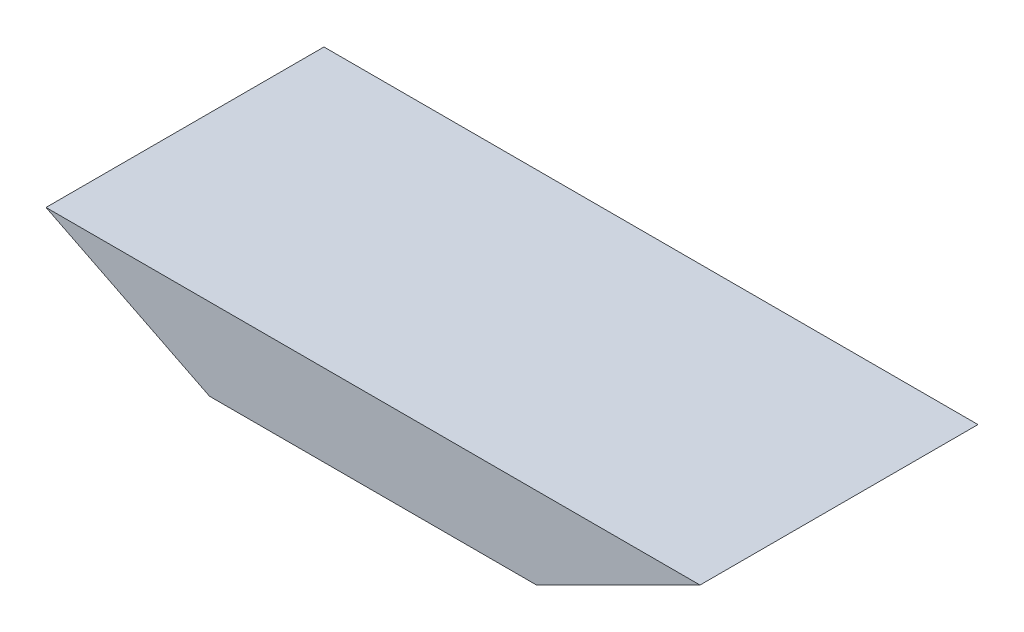
ISO-10303-21;
HEADER;
FILE_DESCRIPTION(('STEP AP214'),'2;1');
FILE_NAME('part.step','',(''),(''),'','','');
FILE_SCHEMA(('AUTOMOTIVE_DESIGN { 1 0 10303 214 1 1 1 1 }'));
ENDSEC;
DATA;
#1=APPLICATION_CONTEXT('core data for automotive mechanical design processes');
#2=APPLICATION_PROTOCOL_DEFINITION('international standard','automotive_design',2000,#1);
#3=PRODUCT_CONTEXT('',#1,'mechanical');
#4=PRODUCT('Part','Part','',(#3));
#5=PRODUCT_RELATED_PRODUCT_CATEGORY('part','',(#4));
#6=PRODUCT_DEFINITION_FORMATION('','',#4);
#7=PRODUCT_DEFINITION_CONTEXT('part definition',#1,'design');
#8=PRODUCT_DEFINITION('design','',#6,#7);
#9=PRODUCT_DEFINITION_SHAPE('','',#8);
#10=(LENGTH_UNIT() NAMED_UNIT(*) SI_UNIT(.MILLI.,.METRE.));
#11=(NAMED_UNIT(*) PLANE_ANGLE_UNIT() SI_UNIT($,.RADIAN.));
#12=(NAMED_UNIT(*) SI_UNIT($,.STERADIAN.) SOLID_ANGLE_UNIT());
#13=UNCERTAINTY_MEASURE_WITH_UNIT(LENGTH_MEASURE(1.E-05),#10,'distance_accuracy_value','');
#14=(GEOMETRIC_REPRESENTATION_CONTEXT(3) GLOBAL_UNCERTAINTY_ASSIGNED_CONTEXT((#13)) GLOBAL_UNIT_ASSIGNED_CONTEXT((#10,
#11,#12)) REPRESENTATION_CONTEXT('',''));
#15=CARTESIAN_POINT('',(0.,0.,0.));
#16=DIRECTION('',(0.,0.,1.));
#17=DIRECTION('',(1.,0.,0.));
#18=AXIS2_PLACEMENT_3D('',#15,#16,#17);
#19=CARTESIAN_POINT('',(-20.,5.,-8.5));
#20=DIRECTION('',(0.,0.,-1.));
#21=DIRECTION('',(-1.,0.,0.));
#22=AXIS2_PLACEMENT_3D('',#19,#20,#21);
#23=PLANE('',#22);
#24=DIRECTION('',(0.894427190999916,-0.447213595499958,0.));
#25=VECTOR('',#24,1.);
#26=CARTESIAN_POINT('',(-9.99999999999999,5.,-8.5));
#27=LINE('',#26,#25);
#28=CARTESIAN_POINT('',(-9.99999999999999,5.,-8.5));
#29=VERTEX_POINT('',#28);
#30=CARTESIAN_POINT('',(0.,0.,-8.5));
#31=VERTEX_POINT('',#30);
#32=EDGE_CURVE('E91',#29,#31,#27,.T.);
#33=ORIENTED_EDGE('',*,*,#32,.F.);
#34=DIRECTION('',(1.,0.,0.));
#35=VECTOR('',#34,1.);
#36=CARTESIAN_POINT('',(-20.,5.,-8.5));
#37=LINE('',#36,#35);
#38=CARTESIAN_POINT('',(30.,5.,-8.5));
#39=VERTEX_POINT('',#38);
#40=EDGE_CURVE('E43',#29,#39,#37,.T.);
#41=ORIENTED_EDGE('',*,*,#40,.T.);
#42=DIRECTION('',(-0.894427190999916,-0.447213595499958,0.));
#43=VECTOR('',#42,1.);
#44=CARTESIAN_POINT('',(30.,5.,-8.5));
#45=LINE('',#44,#43);
#46=CARTESIAN_POINT('',(20.,0.,-8.5));
#47=VERTEX_POINT('',#46);
#48=EDGE_CURVE('E90',#39,#47,#45,.T.);
#49=ORIENTED_EDGE('',*,*,#48,.T.);
#50=DIRECTION('',(1.,0.,0.));
#51=VECTOR('',#50,1.);
#52=CARTESIAN_POINT('',(-20.,0.,-8.5));
#53=LINE('',#52,#51);
#54=EDGE_CURVE('E51',#31,#47,#53,.T.);
#55=ORIENTED_EDGE('',*,*,#54,.F.);
#56=EDGE_LOOP('',(#33,#41,#49,#55));
#57=FACE_BOUND('',#56,.T.);
#58=ADVANCED_FACE('F35',(#57),#23,.T.);
#59=CARTESIAN_POINT('',(-20.,5.,8.5));
#60=DIRECTION('',(0.,0.,-1.));
#61=DIRECTION('',(-1.,0.,0.));
#62=AXIS2_PLACEMENT_3D('',#59,#60,#61);
#63=PLANE('',#62);
#64=DIRECTION('',(1.,0.,0.));
#65=VECTOR('',#64,1.);
#66=CARTESIAN_POINT('',(-20.,5.,8.5));
#67=LINE('',#66,#65);
#68=CARTESIAN_POINT('',(-9.99999999999999,5.,8.5));
#69=VERTEX_POINT('',#68);
#70=CARTESIAN_POINT('',(30.,5.,8.5));
#71=VERTEX_POINT('',#70);
#72=EDGE_CURVE('E11',#69,#71,#67,.T.);
#73=ORIENTED_EDGE('',*,*,#72,.F.);
#74=DIRECTION('',(0.894427190999916,-0.447213595499958,0.));
#75=VECTOR('',#74,1.);
#76=CARTESIAN_POINT('',(-9.99999999999999,5.,8.5));
#77=LINE('',#76,#75);
#78=CARTESIAN_POINT('',(0.,0.,8.5));
#79=VERTEX_POINT('',#78);
#80=EDGE_CURVE('E59',#69,#79,#77,.T.);
#81=ORIENTED_EDGE('',*,*,#80,.T.);
#82=DIRECTION('',(1.,0.,0.));
#83=VECTOR('',#82,1.);
#84=CARTESIAN_POINT('',(-20.,0.,8.5));
#85=LINE('',#84,#83);
#86=CARTESIAN_POINT('',(20.,0.,8.5));
#87=VERTEX_POINT('',#86);
#88=EDGE_CURVE('E38',#79,#87,#85,.T.);
#89=ORIENTED_EDGE('',*,*,#88,.T.);
#90=DIRECTION('',(-0.894427190999916,-0.447213595499958,0.));
#91=VECTOR('',#90,1.);
#92=CARTESIAN_POINT('',(30.,5.,8.5));
#93=LINE('',#92,#91);
#94=EDGE_CURVE('E88',#71,#87,#93,.T.);
#95=ORIENTED_EDGE('',*,*,#94,.F.);
#96=EDGE_LOOP('',(#73,#81,#89,#95));
#97=FACE_BOUND('',#96,.T.);
#98=ADVANCED_FACE('F94',(#97),#63,.F.);
#99=CARTESIAN_POINT('',(0.,5.,0.));
#100=DIRECTION('',(0.,1.,0.));
#101=DIRECTION('',(0.,0.,1.));
#102=AXIS2_PLACEMENT_3D('',#99,#100,#101);
#103=PLANE('',#102);
#104=ORIENTED_EDGE('',*,*,#40,.F.);
#105=DIRECTION('',(0.,0.,-1.));
#106=VECTOR('',#105,1.);
#107=CARTESIAN_POINT('',(-9.99999999999999,5.,8.5));
#108=LINE('',#107,#106);
#109=EDGE_CURVE('E82',#69,#29,#108,.T.);
#110=ORIENTED_EDGE('',*,*,#109,.F.);
#111=ORIENTED_EDGE('',*,*,#72,.T.);
#112=DIRECTION('',(0.,0.,-1.));
#113=VECTOR('',#112,1.);
#114=CARTESIAN_POINT('',(30.,5.,8.5));
#115=LINE('',#114,#113);
#116=EDGE_CURVE('E80',#71,#39,#115,.T.);
#117=ORIENTED_EDGE('',*,*,#116,.T.);
#118=EDGE_LOOP('',(#104,#110,#111,#117));
#119=FACE_BOUND('',#118,.T.);
#120=ADVANCED_FACE('F79',(#119),#103,.T.);
#121=CARTESIAN_POINT('',(0.,0.,0.));
#122=DIRECTION('',(0.,1.,0.));
#123=DIRECTION('',(0.,0.,1.));
#124=AXIS2_PLACEMENT_3D('',#121,#122,#123);
#125=PLANE('',#124);
#126=ORIENTED_EDGE('',*,*,#88,.F.);
#127=DIRECTION('',(0.,0.,-1.));
#128=VECTOR('',#127,1.);
#129=CARTESIAN_POINT('',(0.,0.,8.5));
#130=LINE('',#129,#128);
#131=EDGE_CURVE('E100',#79,#31,#130,.T.);
#132=ORIENTED_EDGE('',*,*,#131,.T.);
#133=ORIENTED_EDGE('',*,*,#54,.T.);
#134=DIRECTION('',(0.,0.,-1.));
#135=VECTOR('',#134,1.);
#136=CARTESIAN_POINT('',(20.,0.,8.5));
#137=LINE('',#136,#135);
#138=EDGE_CURVE('E105',#87,#47,#137,.T.);
#139=ORIENTED_EDGE('',*,*,#138,.F.);
#140=EDGE_LOOP('',(#126,#132,#133,#139));
#141=FACE_BOUND('',#140,.T.);
#142=ADVANCED_FACE('F109',(#141),#125,.F.);
#143=CARTESIAN_POINT('',(-9.99999999999999,5.,8.5));
#144=DIRECTION('',(0.447213595499958,0.894427190999916,0.));
#145=DIRECTION('',(-0.894427190999916,0.447213595499958,0.));
#146=AXIS2_PLACEMENT_3D('',#143,#144,#145);
#147=PLANE('',#146);
#148=ORIENTED_EDGE('',*,*,#32,.T.);
#149=ORIENTED_EDGE('',*,*,#131,.F.);
#150=ORIENTED_EDGE('',*,*,#80,.F.);
#151=ORIENTED_EDGE('',*,*,#109,.T.);
#152=EDGE_LOOP('',(#148,#149,#150,#151));
#153=FACE_BOUND('',#152,.T.);
#154=ADVANCED_FACE('F108',(#153),#147,.F.);
#155=CARTESIAN_POINT('',(30.,5.,8.5));
#156=DIRECTION('',(0.447213595499958,-0.894427190999916,0.));
#157=DIRECTION('',(0.894427190999916,0.447213595499958,0.));
#158=AXIS2_PLACEMENT_3D('',#155,#156,#157);
#159=PLANE('',#158);
#160=ORIENTED_EDGE('',*,*,#48,.F.);
#161=ORIENTED_EDGE('',*,*,#116,.F.);
#162=ORIENTED_EDGE('',*,*,#94,.T.);
#163=ORIENTED_EDGE('',*,*,#138,.T.);
#164=EDGE_LOOP('',(#160,#161,#162,#163));
#165=FACE_BOUND('',#164,.T.);
#166=ADVANCED_FACE('F87',(#165),#159,.T.);
#167=CLOSED_SHELL('',(#58,#98,#120,#142,#154,#166));
#168=MANIFOLD_SOLID_BREP('B2',#167);
#169=ADVANCED_BREP_SHAPE_REPRESENTATION('',(#18,#168),#14);
#170=SHAPE_DEFINITION_REPRESENTATION(#9,#169);
ENDSEC;
END-ISO-10303-21;
